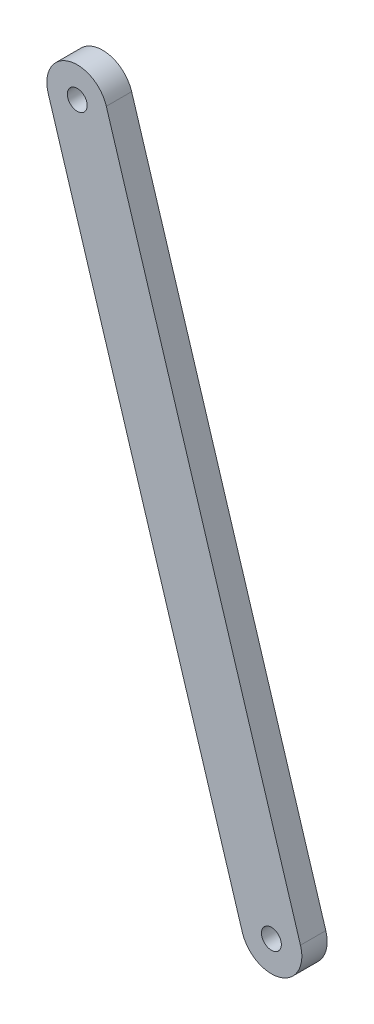
ISO-10303-21;
HEADER;
FILE_DESCRIPTION(('STEP AP214'),'2;1');
FILE_NAME('part.step','',(''),(''),'','','');
FILE_SCHEMA(('AUTOMOTIVE_DESIGN { 1 0 10303 214 1 1 1 1 }'));
ENDSEC;
DATA;
#1=APPLICATION_CONTEXT('core data for automotive mechanical design processes');
#2=APPLICATION_PROTOCOL_DEFINITION('international standard','automotive_design',2000,#1);
#3=PRODUCT_CONTEXT('',#1,'mechanical');
#4=PRODUCT('Part','Part','',(#3));
#5=PRODUCT_RELATED_PRODUCT_CATEGORY('part','',(#4));
#6=PRODUCT_DEFINITION_FORMATION('','',#4);
#7=PRODUCT_DEFINITION_CONTEXT('part definition',#1,'design');
#8=PRODUCT_DEFINITION('design','',#6,#7);
#9=PRODUCT_DEFINITION_SHAPE('','',#8);
#10=(LENGTH_UNIT() NAMED_UNIT(*) SI_UNIT(.MILLI.,.METRE.));
#11=(NAMED_UNIT(*) PLANE_ANGLE_UNIT() SI_UNIT($,.RADIAN.));
#12=(NAMED_UNIT(*) SI_UNIT($,.STERADIAN.) SOLID_ANGLE_UNIT());
#13=UNCERTAINTY_MEASURE_WITH_UNIT(LENGTH_MEASURE(1.E-05),#10,'distance_accuracy_value','');
#14=(GEOMETRIC_REPRESENTATION_CONTEXT(3) GLOBAL_UNCERTAINTY_ASSIGNED_CONTEXT((#13)) GLOBAL_UNIT_ASSIGNED_CONTEXT((#10,
#11,#12)) REPRESENTATION_CONTEXT('',''));
#15=CARTESIAN_POINT('',(0.,0.,0.));
#16=DIRECTION('',(0.,0.,1.));
#17=DIRECTION('',(1.,0.,0.));
#18=AXIS2_PLACEMENT_3D('',#15,#16,#17);
#19=CARTESIAN_POINT('',(247.65,119.126,6.35));
#20=DIRECTION('',(0.,0.,-1.));
#21=DIRECTION('',(-1.,0.,0.));
#22=AXIS2_PLACEMENT_3D('',#19,#20,#21);
#23=CYLINDRICAL_SURFACE('',#22,7.62000000000003);
#24=CARTESIAN_POINT('',(247.65,119.126,0.));
#25=DIRECTION('',(0.,0.,1.));
#26=DIRECTION('',(1.,0.,0.));
#27=AXIS2_PLACEMENT_3D('',#24,#25,#26);
#28=CIRCLE('',#27,7.62000000000003);
#29=CARTESIAN_POINT('',(240.368501738152,116.880074119053,0.));
#30=VERTEX_POINT('',#29);
#31=CARTESIAN_POINT('',(254.931498261848,121.371925880947,0.));
#32=VERTEX_POINT('',#31);
#33=EDGE_CURVE('E128',#30,#32,#28,.T.);
#34=ORIENTED_EDGE('',*,*,#33,.T.);
#35=DIRECTION('',(0.,0.,-1.));
#36=VECTOR('',#35,1.);
#37=CARTESIAN_POINT('',(254.931498261848,121.371925880947,6.35));
#38=LINE('',#37,#36);
#39=CARTESIAN_POINT('',(254.931498261848,121.371925880947,6.35));
#40=VERTEX_POINT('',#39);
#41=EDGE_CURVE('E11',#40,#32,#38,.T.);
#42=ORIENTED_EDGE('',*,*,#41,.F.);
#43=CARTESIAN_POINT('',(247.65,119.126,6.35));
#44=DIRECTION('',(0.,0.,1.));
#45=DIRECTION('',(1.,0.,0.));
#46=AXIS2_PLACEMENT_3D('',#43,#44,#45);
#47=CIRCLE('',#46,7.62000000000003);
#48=CARTESIAN_POINT('',(240.368501738152,116.880074119053,6.35));
#49=VERTEX_POINT('',#48);
#50=EDGE_CURVE('E90',#49,#40,#47,.T.);
#51=ORIENTED_EDGE('',*,*,#50,.F.);
#52=DIRECTION('',(0.,0.,-1.));
#53=VECTOR('',#52,1.);
#54=CARTESIAN_POINT('',(240.368501738152,116.880074119053,6.35));
#55=LINE('',#54,#53);
#56=EDGE_CURVE('E65',#49,#30,#55,.T.);
#57=ORIENTED_EDGE('',*,*,#56,.T.);
#58=EDGE_LOOP('',(#34,#42,#51,#57));
#59=FACE_BOUND('',#58,.T.);
#60=ADVANCED_FACE('F47',(#59),#23,.T.);
#61=CARTESIAN_POINT('',(266.969159441586,82.3447212431829,6.35));
#62=DIRECTION('',(0.955577199717551,0.29474092925816,0.));
#63=DIRECTION('',(-0.29474092925816,0.955577199717551,0.));
#64=AXIS2_PLACEMENT_3D('',#61,#62,#63);
#65=PLANE('',#64);
#66=DIRECTION('',(0.29474092925816,-0.955577199717551,0.));
#67=VECTOR('',#66,1.);
#68=CARTESIAN_POINT('',(266.969159441586,82.3447212431829,0.));
#69=LINE('',#68,#67);
#70=CARTESIAN_POINT('',(206.269770841325,279.137721554317,0.));
#71=VERTEX_POINT('',#70);
#72=EDGE_CURVE('E100',#71,#32,#69,.T.);
#73=ORIENTED_EDGE('',*,*,#72,.F.);
#74=DIRECTION('',(0.,0.,-1.));
#75=VECTOR('',#74,1.);
#76=CARTESIAN_POINT('',(206.269770841325,279.137721554317,6.35));
#77=LINE('',#76,#75);
#78=CARTESIAN_POINT('',(206.269770841325,279.137721554317,6.35));
#79=VERTEX_POINT('',#78);
#80=EDGE_CURVE('E57',#79,#71,#77,.T.);
#81=ORIENTED_EDGE('',*,*,#80,.F.);
#82=DIRECTION('',(0.29474092925816,-0.955577199717551,0.));
#83=VECTOR('',#82,1.);
#84=CARTESIAN_POINT('',(266.969159441586,82.3447212431829,6.35));
#85=LINE('',#84,#83);
#86=EDGE_CURVE('E98',#79,#40,#85,.T.);
#87=ORIENTED_EDGE('',*,*,#86,.T.);
#88=ORIENTED_EDGE('',*,*,#41,.T.);
#89=EDGE_LOOP('',(#73,#81,#87,#88));
#90=FACE_BOUND('',#89,.T.);
#91=ADVANCED_FACE('F97',(#90),#65,.T.);
#92=CARTESIAN_POINT('',(198.988272579477,276.89179567337,6.35));
#93=DIRECTION('',(0.,0.,-1.));
#94=DIRECTION('',(-1.,0.,0.));
#95=AXIS2_PLACEMENT_3D('',#92,#93,#94);
#96=CYLINDRICAL_SURFACE('',#95,7.62000000000003);
#97=CARTESIAN_POINT('',(198.988272579477,276.89179567337,0.));
#98=DIRECTION('',(0.,0.,1.));
#99=DIRECTION('',(1.,0.,0.));
#100=AXIS2_PLACEMENT_3D('',#97,#98,#99);
#101=CIRCLE('',#100,7.62000000000003);
#102=CARTESIAN_POINT('',(191.706774317629,274.645869792422,0.));
#103=VERTEX_POINT('',#102);
#104=EDGE_CURVE('E133',#71,#103,#101,.T.);
#105=ORIENTED_EDGE('',*,*,#104,.T.);
#106=DIRECTION('',(0.,0.,-1.));
#107=VECTOR('',#106,1.);
#108=CARTESIAN_POINT('',(191.706774317629,274.645869792422,6.35));
#109=LINE('',#108,#107);
#110=CARTESIAN_POINT('',(191.706774317629,274.645869792422,6.35));
#111=VERTEX_POINT('',#110);
#112=EDGE_CURVE('E79',#111,#103,#109,.T.);
#113=ORIENTED_EDGE('',*,*,#112,.F.);
#114=CARTESIAN_POINT('',(198.988272579477,276.89179567337,6.35));
#115=DIRECTION('',(0.,0.,1.));
#116=DIRECTION('',(1.,0.,0.));
#117=AXIS2_PLACEMENT_3D('',#114,#115,#116);
#118=CIRCLE('',#117,7.62000000000003);
#119=EDGE_CURVE('E104',#79,#111,#118,.T.);
#120=ORIENTED_EDGE('',*,*,#119,.F.);
#121=ORIENTED_EDGE('',*,*,#80,.T.);
#122=EDGE_LOOP('',(#105,#113,#120,#121));
#123=FACE_BOUND('',#122,.T.);
#124=ADVANCED_FACE('F105',(#123),#96,.T.);
#125=CARTESIAN_POINT('',(252.406162917891,77.8528694812886,6.35));
#126=DIRECTION('',(-0.955577199717551,-0.29474092925816,0.));
#127=DIRECTION('',(0.29474092925816,-0.955577199717551,0.));
#128=AXIS2_PLACEMENT_3D('',#125,#126,#127);
#129=PLANE('',#128);
#130=DIRECTION('',(-0.29474092925816,0.955577199717551,0.));
#131=VECTOR('',#130,1.);
#132=CARTESIAN_POINT('',(252.406162917891,77.8528694812886,0.));
#133=LINE('',#132,#131);
#134=EDGE_CURVE('E136',#30,#103,#133,.T.);
#135=ORIENTED_EDGE('',*,*,#134,.F.);
#136=ORIENTED_EDGE('',*,*,#56,.F.);
#137=DIRECTION('',(-0.29474092925816,0.955577199717551,0.));
#138=VECTOR('',#137,1.);
#139=CARTESIAN_POINT('',(252.406162917891,77.8528694812886,6.35));
#140=LINE('',#139,#138);
#141=EDGE_CURVE('E107',#49,#111,#140,.T.);
#142=ORIENTED_EDGE('',*,*,#141,.T.);
#143=ORIENTED_EDGE('',*,*,#112,.T.);
#144=EDGE_LOOP('',(#135,#136,#142,#143));
#145=FACE_BOUND('',#144,.T.);
#146=ADVANCED_FACE('F175',(#145),#129,.T.);
#147=CARTESIAN_POINT('',(247.65,119.126,6.35));
#148=DIRECTION('',(0.,0.,-1.));
#149=DIRECTION('',(-1.,0.,0.));
#150=AXIS2_PLACEMENT_3D('',#147,#148,#149);
#151=CYLINDRICAL_SURFACE('',#150,2.48920000000001);
#152=CARTESIAN_POINT('',(247.65,119.126,6.35));
#153=DIRECTION('',(0.,0.,1.));
#154=DIRECTION('',(1.,0.,0.));
#155=AXIS2_PLACEMENT_3D('',#152,#153,#154);
#156=CIRCLE('',#155,2.48920000000001);
#157=CARTESIAN_POINT('',(250.1392,119.126,6.35));
#158=VERTEX_POINT('',#157);
#159=EDGE_CURVE('E114',#158,#158,#156,.T.);
#160=ORIENTED_EDGE('',*,*,#159,.T.);
#161=EDGE_LOOP('',(#160));
#162=FACE_BOUND('',#161,.T.);
#163=CARTESIAN_POINT('',(247.65,119.126,0.));
#164=DIRECTION('',(0.,0.,1.));
#165=DIRECTION('',(1.,0.,0.));
#166=AXIS2_PLACEMENT_3D('',#163,#164,#165);
#167=CIRCLE('',#166,2.48920000000001);
#168=CARTESIAN_POINT('',(250.1392,119.126,0.));
#169=VERTEX_POINT('',#168);
#170=EDGE_CURVE('E124',#169,#169,#167,.T.);
#171=ORIENTED_EDGE('',*,*,#170,.F.);
#172=EDGE_LOOP('',(#171));
#173=FACE_BOUND('',#172,.T.);
#174=ADVANCED_FACE('F49',(#162,#173),#151,.F.);
#175=CARTESIAN_POINT('',(198.988272579477,276.89179567337,6.35));
#176=DIRECTION('',(0.,0.,-1.));
#177=DIRECTION('',(-1.,0.,0.));
#178=AXIS2_PLACEMENT_3D('',#175,#176,#177);
#179=CYLINDRICAL_SURFACE('',#178,2.48920000000001);
#180=CARTESIAN_POINT('',(198.988272579477,276.89179567337,6.35));
#181=DIRECTION('',(0.,0.,1.));
#182=DIRECTION('',(1.,0.,0.));
#183=AXIS2_PLACEMENT_3D('',#180,#181,#182);
#184=CIRCLE('',#183,2.48920000000001);
#185=CARTESIAN_POINT('',(201.477472579477,276.89179567337,6.35));
#186=VERTEX_POINT('',#185);
#187=EDGE_CURVE('E120',#186,#186,#184,.T.);
#188=ORIENTED_EDGE('',*,*,#187,.T.);
#189=EDGE_LOOP('',(#188));
#190=FACE_BOUND('',#189,.T.);
#191=CARTESIAN_POINT('',(198.988272579477,276.89179567337,0.));
#192=DIRECTION('',(0.,0.,1.));
#193=DIRECTION('',(1.,0.,0.));
#194=AXIS2_PLACEMENT_3D('',#191,#192,#193);
#195=CIRCLE('',#194,2.48920000000001);
#196=CARTESIAN_POINT('',(201.477472579477,276.89179567337,0.));
#197=VERTEX_POINT('',#196);
#198=EDGE_CURVE('E140',#197,#197,#195,.T.);
#199=ORIENTED_EDGE('',*,*,#198,.F.);
#200=EDGE_LOOP('',(#199));
#201=FACE_BOUND('',#200,.T.);
#202=ADVANCED_FACE('F157',(#190,#201),#179,.F.);
#203=CARTESIAN_POINT('',(0.,0.,6.35));
#204=DIRECTION('',(0.,0.,1.));
#205=DIRECTION('',(1.,0.,0.));
#206=AXIS2_PLACEMENT_3D('',#203,#204,#205);
#207=PLANE('',#206);
#208=ORIENTED_EDGE('',*,*,#159,.F.);
#209=EDGE_LOOP('',(#208));
#210=FACE_BOUND('',#209,.T.);
#211=ORIENTED_EDGE('',*,*,#50,.T.);
#212=ORIENTED_EDGE('',*,*,#86,.F.);
#213=ORIENTED_EDGE('',*,*,#119,.T.);
#214=ORIENTED_EDGE('',*,*,#141,.F.);
#215=EDGE_LOOP('',(#211,#212,#213,#214));
#216=FACE_BOUND('',#215,.T.);
#217=ORIENTED_EDGE('',*,*,#187,.F.);
#218=EDGE_LOOP('',(#217));
#219=FACE_BOUND('',#218,.T.);
#220=ADVANCED_FACE('F109',(#210,#216,#219),#207,.T.);
#221=CARTESIAN_POINT('',(0.,0.,0.));
#222=DIRECTION('',(0.,0.,1.));
#223=DIRECTION('',(1.,0.,0.));
#224=AXIS2_PLACEMENT_3D('',#221,#222,#223);
#225=PLANE('',#224);
#226=ORIENTED_EDGE('',*,*,#170,.T.);
#227=EDGE_LOOP('',(#226));
#228=FACE_BOUND('',#227,.T.);
#229=ORIENTED_EDGE('',*,*,#33,.F.);
#230=ORIENTED_EDGE('',*,*,#134,.T.);
#231=ORIENTED_EDGE('',*,*,#104,.F.);
#232=ORIENTED_EDGE('',*,*,#72,.T.);
#233=EDGE_LOOP('',(#229,#230,#231,#232));
#234=FACE_BOUND('',#233,.T.);
#235=ORIENTED_EDGE('',*,*,#198,.T.);
#236=EDGE_LOOP('',(#235));
#237=FACE_BOUND('',#236,.T.);
#238=ADVANCED_FACE('F156',(#228,#234,#237),#225,.F.);
#239=CLOSED_SHELL('',(#60,#91,#124,#146,#174,#202,#220,#238));
#240=MANIFOLD_SOLID_BREP('B2',#239);
#241=ADVANCED_BREP_SHAPE_REPRESENTATION('',(#18,#240),#14);
#242=SHAPE_DEFINITION_REPRESENTATION(#9,#241);
ENDSEC;
END-ISO-10303-21;
